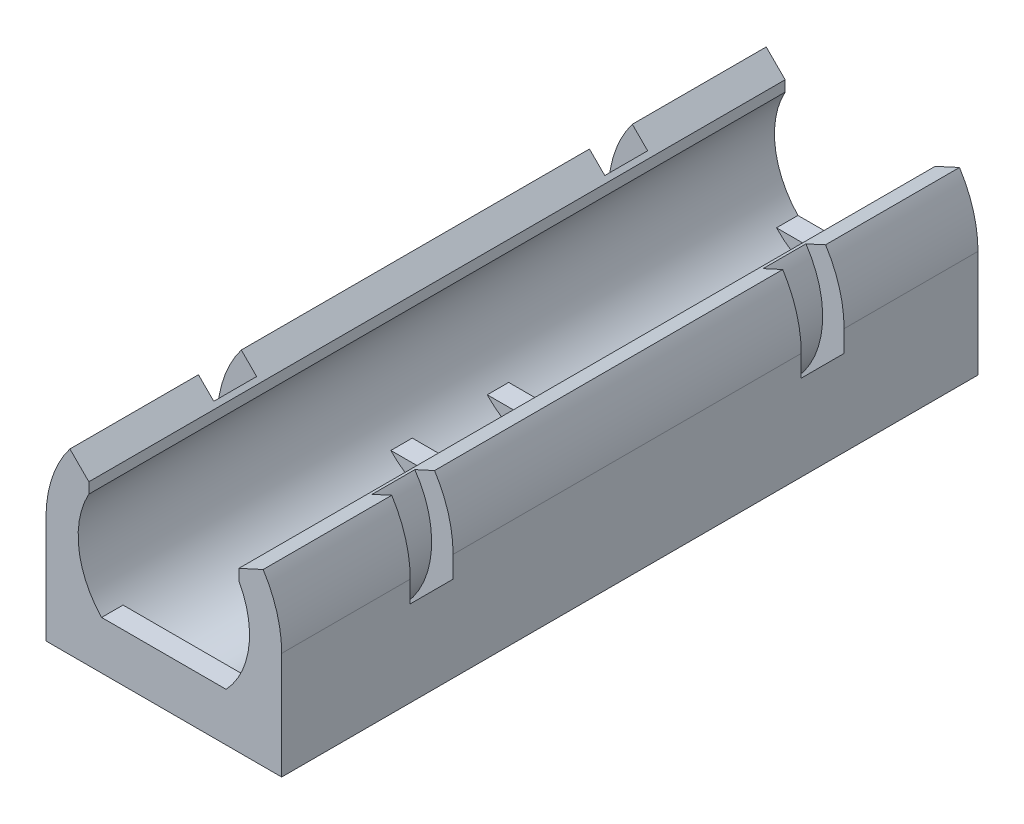
ISO-10303-21;
HEADER;
FILE_DESCRIPTION(('STEP AP214'),'2;1');
FILE_NAME('part.step','',(''),(''),'','','');
FILE_SCHEMA(('AUTOMOTIVE_DESIGN { 1 0 10303 214 1 1 1 1 }'));
ENDSEC;
DATA;
#1=APPLICATION_CONTEXT('core data for automotive mechanical design processes');
#2=APPLICATION_PROTOCOL_DEFINITION('international standard','automotive_design',2000,#1);
#3=PRODUCT_CONTEXT('',#1,'mechanical');
#4=PRODUCT('Part','Part','',(#3));
#5=PRODUCT_RELATED_PRODUCT_CATEGORY('part','',(#4));
#6=PRODUCT_DEFINITION_FORMATION('','',#4);
#7=PRODUCT_DEFINITION_CONTEXT('part definition',#1,'design');
#8=PRODUCT_DEFINITION('design','',#6,#7);
#9=PRODUCT_DEFINITION_SHAPE('','',#8);
#10=(LENGTH_UNIT() NAMED_UNIT(*) SI_UNIT(.MILLI.,.METRE.));
#11=(NAMED_UNIT(*) PLANE_ANGLE_UNIT() SI_UNIT($,.RADIAN.));
#12=(NAMED_UNIT(*) SI_UNIT($,.STERADIAN.) SOLID_ANGLE_UNIT());
#13=UNCERTAINTY_MEASURE_WITH_UNIT(LENGTH_MEASURE(1.E-05),#10,'distance_accuracy_value','');
#14=(GEOMETRIC_REPRESENTATION_CONTEXT(3) GLOBAL_UNCERTAINTY_ASSIGNED_CONTEXT((#13)) GLOBAL_UNIT_ASSIGNED_CONTEXT((#10,
#11,#12)) REPRESENTATION_CONTEXT('',''));
#15=CARTESIAN_POINT('',(0.,0.,0.));
#16=DIRECTION('',(0.,0.,1.));
#17=DIRECTION('',(1.,0.,0.));
#18=AXIS2_PLACEMENT_3D('',#15,#16,#17);
#19=CARTESIAN_POINT('',(0.,0.,32.5));
#20=DIRECTION('',(0.,1.,0.));
#21=DIRECTION('',(-1.,0.,0.));
#22=AXIS2_PLACEMENT_3D('',#19,#20,#21);
#23=PLANE('',#22);
#24=DIRECTION('',(0.,0.,1.));
#25=VECTOR('',#24,1.);
#26=CARTESIAN_POINT('',(3.45016556472926,0.,16.5));
#27=LINE('',#26,#25);
#28=CARTESIAN_POINT('',(3.45016556472926,0.,20.5));
#29=VERTEX_POINT('',#28);
#30=CARTESIAN_POINT('',(3.45016556472926,0.,16.5));
#31=VERTEX_POINT('',#30);
#32=EDGE_CURVE('E559',#29,#31,#27,.F.);
#33=ORIENTED_EDGE('',*,*,#32,.F.);
#34=DIRECTION('',(-1.,0.,0.));
#35=VECTOR('',#34,1.);
#36=CARTESIAN_POINT('',(0.,0.,20.5));
#37=LINE('',#36,#35);
#38=CARTESIAN_POINT('',(18.5498344352707,0.,20.5));
#39=VERTEX_POINT('',#38);
#40=EDGE_CURVE('E576',#39,#29,#37,.T.);
#41=ORIENTED_EDGE('',*,*,#40,.F.);
#42=DIRECTION('',(0.,0.,1.));
#43=VECTOR('',#42,1.);
#44=CARTESIAN_POINT('',(18.5498344352707,0.,16.5));
#45=LINE('',#44,#43);
#46=CARTESIAN_POINT('',(18.5498344352707,0.,16.5));
#47=VERTEX_POINT('',#46);
#48=EDGE_CURVE('E562',#47,#39,#45,.T.);
#49=ORIENTED_EDGE('',*,*,#48,.F.);
#50=DIRECTION('',(-1.,0.,0.));
#51=VECTOR('',#50,1.);
#52=CARTESIAN_POINT('',(0.,0.,16.5));
#53=LINE('',#52,#51);
#54=EDGE_CURVE('E569',#47,#31,#53,.T.);
#55=ORIENTED_EDGE('',*,*,#54,.T.);
#56=EDGE_LOOP('',(#33,#41,#49,#55));
#57=FACE_BOUND('',#56,.T.);
#58=DIRECTION('',(0.,0.,-1.));
#59=VECTOR('',#58,1.);
#60=CARTESIAN_POINT('',(22.,0.,32.5));
#61=LINE('',#60,#59);
#62=CARTESIAN_POINT('',(22.,0.,32.5));
#63=VERTEX_POINT('',#62);
#64=CARTESIAN_POINT('',(22.,0.,-32.5));
#65=VERTEX_POINT('',#64);
#66=EDGE_CURVE('E327',#63,#65,#61,.T.);
#67=ORIENTED_EDGE('',*,*,#66,.F.);
#68=DIRECTION('',(1.,0.,0.));
#69=VECTOR('',#68,1.);
#70=CARTESIAN_POINT('',(0.,0.,32.5));
#71=LINE('',#70,#69);
#72=CARTESIAN_POINT('',(0.,0.,32.5));
#73=VERTEX_POINT('',#72);
#74=EDGE_CURVE('E473',#73,#63,#71,.T.);
#75=ORIENTED_EDGE('',*,*,#74,.F.);
#76=DIRECTION('',(0.,0.,-1.));
#77=VECTOR('',#76,1.);
#78=CARTESIAN_POINT('',(0.,0.,32.5));
#79=LINE('',#78,#77);
#80=CARTESIAN_POINT('',(0.,0.,-32.5));
#81=VERTEX_POINT('',#80);
#82=EDGE_CURVE('E334',#73,#81,#79,.T.);
#83=ORIENTED_EDGE('',*,*,#82,.T.);
#84=DIRECTION('',(1.,0.,0.));
#85=VECTOR('',#84,1.);
#86=CARTESIAN_POINT('',(0.,0.,-32.5));
#87=LINE('',#86,#85);
#88=EDGE_CURVE('E441',#81,#65,#87,.T.);
#89=ORIENTED_EDGE('',*,*,#88,.T.);
#90=EDGE_LOOP('',(#67,#75,#83,#89));
#91=FACE_BOUND('',#90,.T.);
#92=DIRECTION('',(0.,0.,1.));
#93=VECTOR('',#92,1.);
#94=CARTESIAN_POINT('',(3.45016556472926,0.,-20.));
#95=LINE('',#94,#93);
#96=CARTESIAN_POINT('',(3.45016556472926,0.,-16.));
#97=VERTEX_POINT('',#96);
#98=CARTESIAN_POINT('',(3.45016556472926,0.,-20.));
#99=VERTEX_POINT('',#98);
#100=EDGE_CURVE('E627',#97,#99,#95,.F.);
#101=ORIENTED_EDGE('',*,*,#100,.F.);
#102=DIRECTION('',(-1.,0.,0.));
#103=VECTOR('',#102,1.);
#104=CARTESIAN_POINT('',(0.,0.,-16.));
#105=LINE('',#104,#103);
#106=CARTESIAN_POINT('',(18.5498344352707,0.,-16.));
#107=VERTEX_POINT('',#106);
#108=EDGE_CURVE('E644',#107,#97,#105,.T.);
#109=ORIENTED_EDGE('',*,*,#108,.F.);
#110=DIRECTION('',(0.,0.,1.));
#111=VECTOR('',#110,1.);
#112=CARTESIAN_POINT('',(18.5498344352707,0.,-20.));
#113=LINE('',#112,#111);
#114=CARTESIAN_POINT('',(18.5498344352707,0.,-20.));
#115=VERTEX_POINT('',#114);
#116=EDGE_CURVE('E633',#115,#107,#113,.T.);
#117=ORIENTED_EDGE('',*,*,#116,.F.);
#118=DIRECTION('',(-1.,0.,0.));
#119=VECTOR('',#118,1.);
#120=CARTESIAN_POINT('',(0.,0.,-20.));
#121=LINE('',#120,#119);
#122=EDGE_CURVE('E636',#115,#99,#121,.T.);
#123=ORIENTED_EDGE('',*,*,#122,.T.);
#124=EDGE_LOOP('',(#101,#109,#117,#123));
#125=FACE_BOUND('',#124,.T.);
#126=ADVANCED_FACE('F39',(#57,#91,#125),#23,.F.);
#127=CARTESIAN_POINT('',(11.,10.,32.5));
#128=DIRECTION('',(0.,0.,-1.));
#129=DIRECTION('',(-1.,0.,0.));
#130=AXIS2_PLACEMENT_3D('',#127,#128,#129);
#131=CYLINDRICAL_SURFACE('',#130,11.);
#132=CARTESIAN_POINT('',(11.,10.,-16.));
#133=DIRECTION('',(0.,0.,-1.));
#134=DIRECTION('',(-1.,0.,0.));
#135=AXIS2_PLACEMENT_3D('',#132,#133,#134);
#136=CIRCLE('',#135,11.);
#137=CARTESIAN_POINT('',(0.,10.,-16.));
#138=VERTEX_POINT('',#137);
#139=CARTESIAN_POINT('',(2.23136675272622,16.6416165934812,-16.));
#140=VERTEX_POINT('',#139);
#141=EDGE_CURVE('E412',#138,#140,#136,.T.);
#142=ORIENTED_EDGE('',*,*,#141,.F.);
#143=DIRECTION('',(0.,0.,-1.));
#144=VECTOR('',#143,1.);
#145=CARTESIAN_POINT('',(0.,10.,32.5));
#146=LINE('',#145,#144);
#147=CARTESIAN_POINT('',(0.,10.,16.5));
#148=VERTEX_POINT('',#147);
#149=EDGE_CURVE('E348',#148,#138,#146,.T.);
#150=ORIENTED_EDGE('',*,*,#149,.F.);
#151=CARTESIAN_POINT('',(11.,10.,16.5));
#152=DIRECTION('',(0.,0.,-1.));
#153=DIRECTION('',(-1.,0.,0.));
#154=AXIS2_PLACEMENT_3D('',#151,#152,#153);
#155=CIRCLE('',#154,11.);
#156=CARTESIAN_POINT('',(2.23136675272622,16.6416165934812,16.5));
#157=VERTEX_POINT('',#156);
#158=EDGE_CURVE('E619',#148,#157,#155,.T.);
#159=ORIENTED_EDGE('',*,*,#158,.T.);
#160=DIRECTION('',(0.,0.,-1.));
#161=VECTOR('',#160,1.);
#162=CARTESIAN_POINT('',(2.23136675272622,16.6416165934812,32.5));
#163=LINE('',#162,#161);
#164=EDGE_CURVE('E354',#157,#140,#163,.T.);
#165=ORIENTED_EDGE('',*,*,#164,.T.);
#166=EDGE_LOOP('',(#142,#150,#159,#165));
#167=FACE_BOUND('',#166,.T.);
#168=ADVANCED_FACE('F695',(#167),#131,.T.);
#169=CARTESIAN_POINT('',(11.,10.,32.5));
#170=DIRECTION('',(0.,0.,-1.));
#171=DIRECTION('',(-1.,0.,0.));
#172=AXIS2_PLACEMENT_3D('',#169,#170,#171);
#173=CYLINDRICAL_SURFACE('',#172,11.);
#174=CARTESIAN_POINT('',(20.2726264490755,15.9176345557921,-16.));
#175=VERTEX_POINT('',#174);
#176=CARTESIAN_POINT('',(22.,10.,-16.));
#177=VERTEX_POINT('',#176);
#178=EDGE_CURVE('E400',#175,#177,#136,.T.);
#179=ORIENTED_EDGE('',*,*,#178,.F.);
#180=DIRECTION('',(0.,0.,-1.));
#181=VECTOR('',#180,1.);
#182=CARTESIAN_POINT('',(20.2726264490755,15.9176345557921,32.5));
#183=LINE('',#182,#181);
#184=CARTESIAN_POINT('',(20.2726264490755,15.9176345557921,16.5));
#185=VERTEX_POINT('',#184);
#186=EDGE_CURVE('E322',#185,#175,#183,.T.);
#187=ORIENTED_EDGE('',*,*,#186,.F.);
#188=CARTESIAN_POINT('',(22.,10.,16.5));
#189=VERTEX_POINT('',#188);
#190=EDGE_CURVE('E595',#185,#189,#155,.T.);
#191=ORIENTED_EDGE('',*,*,#190,.T.);
#192=DIRECTION('',(0.,0.,-1.));
#193=VECTOR('',#192,1.);
#194=CARTESIAN_POINT('',(22.,10.,32.5));
#195=LINE('',#194,#193);
#196=EDGE_CURVE('E312',#189,#177,#195,.T.);
#197=ORIENTED_EDGE('',*,*,#196,.T.);
#198=EDGE_LOOP('',(#179,#187,#191,#197));
#199=FACE_BOUND('',#198,.T.);
#200=ADVANCED_FACE('F408',(#199),#173,.T.);
#201=CARTESIAN_POINT('',(11.,10.,20.5));
#202=DIRECTION('',(0.,0.,-1.));
#203=DIRECTION('',(-1.,0.,0.));
#204=AXIS2_PLACEMENT_3D('',#201,#202,#203);
#205=CIRCLE('',#204,11.);
#206=CARTESIAN_POINT('',(0.,10.,20.5));
#207=VERTEX_POINT('',#206);
#208=CARTESIAN_POINT('',(2.23136675272622,16.6416165934812,20.5));
#209=VERTEX_POINT('',#208);
#210=EDGE_CURVE('E604',#207,#209,#205,.T.);
#211=ORIENTED_EDGE('',*,*,#210,.F.);
#212=CARTESIAN_POINT('',(0.,10.,32.5));
#213=VERTEX_POINT('',#212);
#214=EDGE_CURVE('E343',#213,#207,#146,.T.);
#215=ORIENTED_EDGE('',*,*,#214,.F.);
#216=CARTESIAN_POINT('',(11.,10.,32.5));
#217=DIRECTION('',(0.,0.,1.));
#218=DIRECTION('',(1.,0.,0.));
#219=AXIS2_PLACEMENT_3D('',#216,#217,#218);
#220=CIRCLE('',#219,11.);
#221=CARTESIAN_POINT('',(2.23136675272622,16.6416165934812,32.5));
#222=VERTEX_POINT('',#221);
#223=EDGE_CURVE('E478',#222,#213,#220,.T.);
#224=ORIENTED_EDGE('',*,*,#223,.F.);
#225=EDGE_CURVE('E349',#222,#209,#163,.T.);
#226=ORIENTED_EDGE('',*,*,#225,.T.);
#227=EDGE_LOOP('',(#211,#215,#224,#226));
#228=FACE_BOUND('',#227,.T.);
#229=ADVANCED_FACE('F771',(#228),#131,.T.);
#230=CARTESIAN_POINT('',(20.2726264490755,15.9176345557921,20.5));
#231=VERTEX_POINT('',#230);
#232=CARTESIAN_POINT('',(22.,10.,20.5));
#233=VERTEX_POINT('',#232);
#234=EDGE_CURVE('E607',#231,#233,#205,.T.);
#235=ORIENTED_EDGE('',*,*,#234,.F.);
#236=CARTESIAN_POINT('',(20.2726264490755,15.9176345557921,32.5));
#237=VERTEX_POINT('',#236);
#238=EDGE_CURVE('E313',#237,#231,#183,.T.);
#239=ORIENTED_EDGE('',*,*,#238,.F.);
#240=CARTESIAN_POINT('',(11.,10.,32.5));
#241=DIRECTION('',(0.,0.,1.));
#242=DIRECTION('',(1.,0.,0.));
#243=AXIS2_PLACEMENT_3D('',#240,#241,#242);
#244=CIRCLE('',#243,11.);
#245=CARTESIAN_POINT('',(22.,10.,32.5));
#246=VERTEX_POINT('',#245);
#247=EDGE_CURVE('E468',#246,#237,#244,.T.);
#248=ORIENTED_EDGE('',*,*,#247,.F.);
#249=EDGE_CURVE('E315',#246,#233,#195,.T.);
#250=ORIENTED_EDGE('',*,*,#249,.T.);
#251=EDGE_LOOP('',(#235,#239,#248,#250));
#252=FACE_BOUND('',#251,.T.);
#253=ADVANCED_FACE('F719',(#252),#173,.T.);
#254=CARTESIAN_POINT('',(11.,10.,32.5));
#255=DIRECTION('',(0.,0.,-1.));
#256=DIRECTION('',(-1.,0.,0.));
#257=AXIS2_PLACEMENT_3D('',#254,#255,#256);
#258=CYLINDRICAL_SURFACE('',#257,8.);
#259=CARTESIAN_POINT('',(11.,10.,3.5));
#260=DIRECTION('',(0.,0.,1.));
#261=DIRECTION('',(1.,0.,0.));
#262=AXIS2_PLACEMENT_3D('',#259,#260,#261);
#263=CIRCLE('',#262,8.);
#264=CARTESIAN_POINT('',(16.8094750193111,4.5,3.5));
#265=VERTEX_POINT('',#264);
#266=CARTESIAN_POINT('',(5.19052498068889,4.5,3.5));
#267=VERTEX_POINT('',#266);
#268=EDGE_CURVE('E525',#265,#267,#263,.F.);
#269=ORIENTED_EDGE('',*,*,#268,.F.);
#270=DIRECTION('',(0.,0.,-1.));
#271=VECTOR('',#270,1.);
#272=CARTESIAN_POINT('',(16.8094750193111,4.5,32.5));
#273=LINE('',#272,#271);
#274=CARTESIAN_POINT('',(16.8094750193111,4.5,5.5));
#275=VERTEX_POINT('',#274);
#276=EDGE_CURVE('E374',#265,#275,#273,.F.);
#277=ORIENTED_EDGE('',*,*,#276,.T.);
#278=CARTESIAN_POINT('',(11.,10.,5.5));
#279=DIRECTION('',(0.,0.,1.));
#280=DIRECTION('',(1.,0.,0.));
#281=AXIS2_PLACEMENT_3D('',#278,#279,#280);
#282=CIRCLE('',#281,8.);
#283=CARTESIAN_POINT('',(5.19052498068889,4.5,5.5));
#284=VERTEX_POINT('',#283);
#285=EDGE_CURVE('E529',#275,#284,#282,.F.);
#286=ORIENTED_EDGE('',*,*,#285,.T.);
#287=DIRECTION('',(0.,0.,-1.));
#288=VECTOR('',#287,1.);
#289=CARTESIAN_POINT('',(5.19052498068889,4.5,32.5));
#290=LINE('',#289,#288);
#291=EDGE_CURVE('E370',#284,#267,#290,.T.);
#292=ORIENTED_EDGE('',*,*,#291,.T.);
#293=EDGE_LOOP('',(#269,#277,#286,#292));
#294=FACE_BOUND('',#293,.T.);
#295=CARTESIAN_POINT('',(11.,10.,-5.49999999999999));
#296=DIRECTION('',(0.,0.,1.));
#297=DIRECTION('',(1.,0.,0.));
#298=AXIS2_PLACEMENT_3D('',#295,#296,#297);
#299=CIRCLE('',#298,8.);
#300=CARTESIAN_POINT('',(16.8094750193111,4.5,-5.49999999999999));
#301=VERTEX_POINT('',#300);
#302=CARTESIAN_POINT('',(5.19052498068889,4.5,-5.49999999999999));
#303=VERTEX_POINT('',#302);
#304=EDGE_CURVE('E510',#301,#303,#299,.F.);
#305=ORIENTED_EDGE('',*,*,#304,.F.);
#306=DIRECTION('',(0.,0.,-1.));
#307=VECTOR('',#306,1.);
#308=CARTESIAN_POINT('',(16.8094750193111,4.5,32.5));
#309=LINE('',#308,#307);
#310=CARTESIAN_POINT('',(16.8094750193111,4.5,-3.49999999999999));
#311=VERTEX_POINT('',#310);
#312=EDGE_CURVE('E366',#301,#311,#309,.F.);
#313=ORIENTED_EDGE('',*,*,#312,.T.);
#314=CARTESIAN_POINT('',(11.,10.,-3.49999999999999));
#315=DIRECTION('',(0.,0.,1.));
#316=DIRECTION('',(1.,0.,0.));
#317=AXIS2_PLACEMENT_3D('',#314,#315,#316);
#318=CIRCLE('',#317,8.);
#319=CARTESIAN_POINT('',(5.19052498068889,4.5,-3.49999999999999));
#320=VERTEX_POINT('',#319);
#321=EDGE_CURVE('E514',#311,#320,#318,.F.);
#322=ORIENTED_EDGE('',*,*,#321,.T.);
#323=DIRECTION('',(0.,0.,-1.));
#324=VECTOR('',#323,1.);
#325=CARTESIAN_POINT('',(5.19052498068889,4.5,32.5));
#326=LINE('',#325,#324);
#327=EDGE_CURVE('E362',#320,#303,#326,.T.);
#328=ORIENTED_EDGE('',*,*,#327,.T.);
#329=EDGE_LOOP('',(#305,#313,#322,#328));
#330=FACE_BOUND('',#329,.T.);
#331=CARTESIAN_POINT('',(11.,10.,30.5));
#332=DIRECTION('',(0.,0.,-1.));
#333=DIRECTION('',(-1.,0.,0.));
#334=AXIS2_PLACEMENT_3D('',#331,#332,#333);
#335=CIRCLE('',#334,8.);
#336=CARTESIAN_POINT('',(5.19052498068889,4.5,30.5));
#337=VERTEX_POINT('',#336);
#338=CARTESIAN_POINT('',(16.8094750193111,4.5,30.5));
#339=VERTEX_POINT('',#338);
#340=EDGE_CURVE('E540',#337,#339,#335,.F.);
#341=ORIENTED_EDGE('',*,*,#340,.T.);
#342=DIRECTION('',(0.,0.,-1.));
#343=VECTOR('',#342,1.);
#344=CARTESIAN_POINT('',(16.8094750193111,4.5,32.5));
#345=LINE('',#344,#343);
#346=CARTESIAN_POINT('',(16.8094750193111,4.5,32.5));
#347=VERTEX_POINT('',#346);
#348=EDGE_CURVE('E544',#339,#347,#345,.F.);
#349=ORIENTED_EDGE('',*,*,#348,.T.);
#350=CARTESIAN_POINT('',(11.,10.,32.5));
#351=DIRECTION('',(0.,0.,-1.));
#352=DIRECTION('',(1.,0.,0.));
#353=AXIS2_PLACEMENT_3D('',#350,#351,#352);
#354=CIRCLE('',#353,8.);
#355=CARTESIAN_POINT('',(18.,13.8729833462074,32.5));
#356=VERTEX_POINT('',#355);
#357=EDGE_CURVE('E487',#356,#347,#354,.T.);
#358=ORIENTED_EDGE('',*,*,#357,.F.);
#359=DIRECTION('',(0.,0.,-1.));
#360=VECTOR('',#359,1.);
#361=CARTESIAN_POINT('',(18.,13.8729833462074,32.5));
#362=LINE('',#361,#360);
#363=CARTESIAN_POINT('',(18.,13.8729833462074,-32.5));
#364=VERTEX_POINT('',#363);
#365=EDGE_CURVE('E424',#356,#364,#362,.T.);
#366=ORIENTED_EDGE('',*,*,#365,.T.);
#367=CARTESIAN_POINT('',(11.,10.,-32.5));
#368=DIRECTION('',(0.,0.,-1.));
#369=DIRECTION('',(1.,0.,0.));
#370=AXIS2_PLACEMENT_3D('',#367,#368,#369);
#371=CIRCLE('',#370,8.);
#372=CARTESIAN_POINT('',(16.8094750193111,4.5,-32.5));
#373=VERTEX_POINT('',#372);
#374=EDGE_CURVE('E458',#364,#373,#371,.T.);
#375=ORIENTED_EDGE('',*,*,#374,.T.);
#376=DIRECTION('',(0.,0.,-1.));
#377=VECTOR('',#376,1.);
#378=CARTESIAN_POINT('',(16.8094750193111,4.5,32.5));
#379=LINE('',#378,#377);
#380=CARTESIAN_POINT('',(16.8094750193111,4.5,-30.5));
#381=VERTEX_POINT('',#380);
#382=EDGE_CURVE('E495',#373,#381,#379,.F.);
#383=ORIENTED_EDGE('',*,*,#382,.T.);
#384=CARTESIAN_POINT('',(11.,10.,-30.5));
#385=DIRECTION('',(0.,0.,1.));
#386=DIRECTION('',(1.,0.,0.));
#387=AXIS2_PLACEMENT_3D('',#384,#385,#386);
#388=CIRCLE('',#387,8.);
#389=CARTESIAN_POINT('',(5.19052498068889,4.5,-30.5));
#390=VERTEX_POINT('',#389);
#391=EDGE_CURVE('E491',#381,#390,#388,.F.);
#392=ORIENTED_EDGE('',*,*,#391,.T.);
#393=DIRECTION('',(0.,0.,-1.));
#394=VECTOR('',#393,1.);
#395=CARTESIAN_POINT('',(5.19052498068889,4.5,32.5));
#396=LINE('',#395,#394);
#397=CARTESIAN_POINT('',(5.19052498068889,4.5,-32.5));
#398=VERTEX_POINT('',#397);
#399=EDGE_CURVE('E499',#390,#398,#396,.T.);
#400=ORIENTED_EDGE('',*,*,#399,.T.);
#401=CARTESIAN_POINT('',(4.,13.8729833462074,-32.5));
#402=VERTEX_POINT('',#401);
#403=EDGE_CURVE('E462',#398,#402,#371,.T.);
#404=ORIENTED_EDGE('',*,*,#403,.T.);
#405=DIRECTION('',(0.,0.,-1.));
#406=VECTOR('',#405,1.);
#407=CARTESIAN_POINT('',(4.,13.8729833462074,32.5));
#408=LINE('',#407,#406);
#409=CARTESIAN_POINT('',(4.,13.8729833462074,32.5));
#410=VERTEX_POINT('',#409);
#411=EDGE_CURVE('E358',#410,#402,#408,.T.);
#412=ORIENTED_EDGE('',*,*,#411,.F.);
#413=CARTESIAN_POINT('',(5.19052498068889,4.5,32.5));
#414=VERTEX_POINT('',#413);
#415=EDGE_CURVE('E432',#414,#410,#354,.T.);
#416=ORIENTED_EDGE('',*,*,#415,.F.);
#417=DIRECTION('',(0.,0.,-1.));
#418=VECTOR('',#417,1.);
#419=CARTESIAN_POINT('',(5.19052498068889,4.5,32.5));
#420=LINE('',#419,#418);
#421=EDGE_CURVE('E548',#414,#337,#420,.T.);
#422=ORIENTED_EDGE('',*,*,#421,.T.);
#423=EDGE_LOOP('',(#341,#349,#358,#366,#375,#383,#392,#400,#404,#412,#416,#422));
#424=FACE_BOUND('',#423,.T.);
#425=ADVANCED_FACE('F41',(#294,#330,#424),#258,.F.);
#426=CARTESIAN_POINT('',(4.,13.8729833462074,32.5));
#427=DIRECTION('',(-1.,0.,0.));
#428=DIRECTION('',(0.,0.,1.));
#429=AXIS2_PLACEMENT_3D('',#426,#427,#428);
#430=PLANE('',#429);
#431=DIRECTION('',(0.,1.,0.));
#432=VECTOR('',#431,1.);
#433=CARTESIAN_POINT('',(4.,13.8729833462074,-32.5));
#434=LINE('',#433,#432);
#435=CARTESIAN_POINT('',(4.,14.8729833462074,-32.5));
#436=VERTEX_POINT('',#435);
#437=EDGE_CURVE('E455',#402,#436,#434,.T.);
#438=ORIENTED_EDGE('',*,*,#437,.T.);
#439=DIRECTION('',(0.,0.,-1.));
#440=VECTOR('',#439,1.);
#441=CARTESIAN_POINT('',(4.,14.8729833462074,32.5));
#442=LINE('',#441,#440);
#443=CARTESIAN_POINT('',(4.,14.8729833462074,32.5));
#444=VERTEX_POINT('',#443);
#445=EDGE_CURVE('E353',#444,#436,#442,.T.);
#446=ORIENTED_EDGE('',*,*,#445,.F.);
#447=DIRECTION('',(0.,1.,0.));
#448=VECTOR('',#447,1.);
#449=CARTESIAN_POINT('',(4.,13.8729833462074,32.5));
#450=LINE('',#449,#448);
#451=EDGE_CURVE('E484',#410,#444,#450,.T.);
#452=ORIENTED_EDGE('',*,*,#451,.F.);
#453=ORIENTED_EDGE('',*,*,#411,.T.);
#454=EDGE_LOOP('',(#438,#446,#452,#453));
#455=FACE_BOUND('',#454,.T.);
#456=ADVANCED_FACE('F752',(#455),#430,.F.);
#457=CARTESIAN_POINT('',(4.,14.8729833462074,32.5));
#458=DIRECTION('',(-0.707106781186546,-0.707106781186548,0.));
#459=DIRECTION('',(0.707106781186549,-0.707106781186546,0.));
#460=AXIS2_PLACEMENT_3D('',#457,#458,#459);
#461=PLANE('',#460);
#462=CARTESIAN_POINT('',(2.23136675272622,16.6416165934812,-20.));
#463=VERTEX_POINT('',#462);
#464=CARTESIAN_POINT('',(2.23136675272622,16.6416165934812,-32.5));
#465=VERTEX_POINT('',#464);
#466=EDGE_CURVE('E347',#463,#465,#163,.T.);
#467=ORIENTED_EDGE('',*,*,#466,.F.);
#468=DIRECTION('',(0.707106781186549,-0.707106781186546,0.));
#469=VECTOR('',#468,1.);
#470=CARTESIAN_POINT('',(4.,14.8729833462074,-20.));
#471=LINE('',#470,#469);
#472=CARTESIAN_POINT('',(3.66202356507875,15.2109597811287,-20.));
#473=VERTEX_POINT('',#472);
#474=EDGE_CURVE('E640',#463,#473,#471,.T.);
#475=ORIENTED_EDGE('',*,*,#474,.T.);
#476=DIRECTION('',(0.,0.,1.));
#477=VECTOR('',#476,1.);
#478=CARTESIAN_POINT('',(3.66202356507875,15.2109597811287,-20.));
#479=LINE('',#478,#477);
#480=CARTESIAN_POINT('',(3.66202356507875,15.2109597811287,-16.));
#481=VERTEX_POINT('',#480);
#482=EDGE_CURVE('E650',#473,#481,#479,.T.);
#483=ORIENTED_EDGE('',*,*,#482,.T.);
#484=DIRECTION('',(0.707106781186549,-0.707106781186546,0.));
#485=VECTOR('',#484,1.);
#486=CARTESIAN_POINT('',(4.,14.8729833462074,-16.));
#487=LINE('',#486,#485);
#488=EDGE_CURVE('E647',#140,#481,#487,.T.);
#489=ORIENTED_EDGE('',*,*,#488,.F.);
#490=ORIENTED_EDGE('',*,*,#164,.F.);
#491=DIRECTION('',(0.707106781186549,-0.707106781186546,0.));
#492=VECTOR('',#491,1.);
#493=CARTESIAN_POINT('',(4.,14.8729833462074,16.5));
#494=LINE('',#493,#492);
#495=CARTESIAN_POINT('',(3.66202356507876,15.2109597811287,16.5));
#496=VERTEX_POINT('',#495);
#497=EDGE_CURVE('E565',#157,#496,#494,.T.);
#498=ORIENTED_EDGE('',*,*,#497,.T.);
#499=DIRECTION('',(0.,0.,1.));
#500=VECTOR('',#499,1.);
#501=CARTESIAN_POINT('',(3.66202356507876,15.2109597811287,16.5));
#502=LINE('',#501,#500);
#503=CARTESIAN_POINT('',(3.66202356507876,15.2109597811287,20.5));
#504=VERTEX_POINT('',#503);
#505=EDGE_CURVE('E579',#496,#504,#502,.T.);
#506=ORIENTED_EDGE('',*,*,#505,.T.);
#507=DIRECTION('',(0.707106781186549,-0.707106781186546,0.));
#508=VECTOR('',#507,1.);
#509=CARTESIAN_POINT('',(4.,14.8729833462074,20.5));
#510=LINE('',#509,#508);
#511=EDGE_CURVE('E573',#209,#504,#510,.T.);
#512=ORIENTED_EDGE('',*,*,#511,.F.);
#513=ORIENTED_EDGE('',*,*,#225,.F.);
#514=DIRECTION('',(-0.707106781186549,0.707106781186546,0.));
#515=VECTOR('',#514,1.);
#516=CARTESIAN_POINT('',(4.,14.8729833462074,32.5));
#517=LINE('',#516,#515);
#518=EDGE_CURVE('E481',#444,#222,#517,.T.);
#519=ORIENTED_EDGE('',*,*,#518,.F.);
#520=ORIENTED_EDGE('',*,*,#445,.T.);
#521=DIRECTION('',(-0.707106781186549,0.707106781186546,0.));
#522=VECTOR('',#521,1.);
#523=CARTESIAN_POINT('',(4.,14.8729833462074,-32.5));
#524=LINE('',#523,#522);
#525=EDGE_CURVE('E451',#436,#465,#524,.T.);
#526=ORIENTED_EDGE('',*,*,#525,.T.);
#527=EDGE_LOOP('',(#467,#475,#483,#489,#490,#498,#506,#512,#513,#519,#520,#526));
#528=FACE_BOUND('',#527,.T.);
#529=ADVANCED_FACE('F684',(#528),#461,.F.);
#530=CARTESIAN_POINT('',(0.,10.,-20.));
#531=VERTEX_POINT('',#530);
#532=CARTESIAN_POINT('',(0.,10.,-32.5));
#533=VERTEX_POINT('',#532);
#534=EDGE_CURVE('E340',#531,#533,#146,.T.);
#535=ORIENTED_EDGE('',*,*,#534,.F.);
#536=CARTESIAN_POINT('',(11.,10.,-20.));
#537=DIRECTION('',(0.,0.,-1.));
#538=DIRECTION('',(-1.,0.,0.));
#539=AXIS2_PLACEMENT_3D('',#536,#537,#538);
#540=CIRCLE('',#539,11.);
#541=EDGE_CURVE('E294',#531,#463,#540,.T.);
#542=ORIENTED_EDGE('',*,*,#541,.T.);
#543=ORIENTED_EDGE('',*,*,#466,.T.);
#544=CARTESIAN_POINT('',(11.,10.,-32.5));
#545=DIRECTION('',(0.,0.,1.));
#546=DIRECTION('',(1.,0.,0.));
#547=AXIS2_PLACEMENT_3D('',#544,#545,#546);
#548=CIRCLE('',#547,11.);
#549=EDGE_CURVE('E447',#465,#533,#548,.T.);
#550=ORIENTED_EDGE('',*,*,#549,.T.);
#551=EDGE_LOOP('',(#535,#542,#543,#550));
#552=FACE_BOUND('',#551,.T.);
#553=ADVANCED_FACE('F792',(#552),#131,.T.);
#554=CARTESIAN_POINT('',(0.,0.,32.5));
#555=DIRECTION('',(1.,0.,0.));
#556=DIRECTION('',(0.,1.,0.));
#557=AXIS2_PLACEMENT_3D('',#554,#555,#556);
#558=PLANE('',#557);
#559=DIRECTION('',(0.,0.,1.));
#560=VECTOR('',#559,1.);
#561=CARTESIAN_POINT('',(0.,8.00000000000001,-20.));
#562=LINE('',#561,#560);
#563=CARTESIAN_POINT('',(0.,8.00000000000002,-20.));
#564=VERTEX_POINT('',#563);
#565=CARTESIAN_POINT('',(0.,8.00000000000001,-16.));
#566=VERTEX_POINT('',#565);
#567=EDGE_CURVE('E657',#564,#566,#562,.T.);
#568=ORIENTED_EDGE('',*,*,#567,.F.);
#569=DIRECTION('',(0.,1.,0.));
#570=VECTOR('',#569,1.);
#571=CARTESIAN_POINT('',(0.,10.,-20.));
#572=LINE('',#571,#570);
#573=EDGE_CURVE('E63',#564,#531,#572,.T.);
#574=ORIENTED_EDGE('',*,*,#573,.T.);
#575=ORIENTED_EDGE('',*,*,#534,.T.);
#576=DIRECTION('',(0.,-1.,0.));
#577=VECTOR('',#576,1.);
#578=CARTESIAN_POINT('',(0.,0.,-32.5));
#579=LINE('',#578,#577);
#580=EDGE_CURVE('E444',#533,#81,#579,.T.);
#581=ORIENTED_EDGE('',*,*,#580,.T.);
#582=ORIENTED_EDGE('',*,*,#82,.F.);
#583=DIRECTION('',(0.,-1.,0.));
#584=VECTOR('',#583,1.);
#585=CARTESIAN_POINT('',(0.,0.,32.5));
#586=LINE('',#585,#584);
#587=EDGE_CURVE('E476',#213,#73,#586,.T.);
#588=ORIENTED_EDGE('',*,*,#587,.F.);
#589=ORIENTED_EDGE('',*,*,#214,.T.);
#590=DIRECTION('',(0.,1.,0.));
#591=VECTOR('',#590,1.);
#592=CARTESIAN_POINT('',(0.,10.,20.5));
#593=LINE('',#592,#591);
#594=CARTESIAN_POINT('',(0.,8.00000000000001,20.5));
#595=VERTEX_POINT('',#594);
#596=EDGE_CURVE('E592',#595,#207,#593,.T.);
#597=ORIENTED_EDGE('',*,*,#596,.F.);
#598=DIRECTION('',(0.,0.,1.));
#599=VECTOR('',#598,1.);
#600=CARTESIAN_POINT('',(0.,8.00000000000001,16.5));
#601=LINE('',#600,#599);
#602=CARTESIAN_POINT('',(0.,8.00000000000002,16.5));
#603=VERTEX_POINT('',#602);
#604=EDGE_CURVE('E587',#603,#595,#601,.T.);
#605=ORIENTED_EDGE('',*,*,#604,.F.);
#606=DIRECTION('',(0.,1.,0.));
#607=VECTOR('',#606,1.);
#608=CARTESIAN_POINT('',(0.,10.,16.5));
#609=LINE('',#608,#607);
#610=EDGE_CURVE('E591',#603,#148,#609,.T.);
#611=ORIENTED_EDGE('',*,*,#610,.T.);
#612=ORIENTED_EDGE('',*,*,#149,.T.);
#613=DIRECTION('',(0.,1.,0.));
#614=VECTOR('',#613,1.);
#615=CARTESIAN_POINT('',(0.,10.,-16.));
#616=LINE('',#615,#614);
#617=EDGE_CURVE('E304',#566,#138,#616,.T.);
#618=ORIENTED_EDGE('',*,*,#617,.F.);
#619=EDGE_LOOP('',(#568,#574,#575,#581,#582,#588,#589,#597,#605,#611,#612,#618));
#620=FACE_BOUND('',#619,.T.);
#621=ADVANCED_FACE('F732',(#620),#558,.F.);
#622=CARTESIAN_POINT('',(22.,0.,32.5));
#623=DIRECTION('',(-1.,0.,0.));
#624=DIRECTION('',(0.,0.,1.));
#625=AXIS2_PLACEMENT_3D('',#622,#623,#624);
#626=PLANE('',#625);
#627=CARTESIAN_POINT('',(22.,10.,-20.));
#628=VERTEX_POINT('',#627);
#629=CARTESIAN_POINT('',(22.,10.,-32.5));
#630=VERTEX_POINT('',#629);
#631=EDGE_CURVE('E300',#628,#630,#195,.T.);
#632=ORIENTED_EDGE('',*,*,#631,.F.);
#633=DIRECTION('',(0.,-1.,0.));
#634=VECTOR('',#633,1.);
#635=CARTESIAN_POINT('',(22.,10.,-20.));
#636=LINE('',#635,#634);
#637=CARTESIAN_POINT('',(22.,8.00000000000001,-20.));
#638=VERTEX_POINT('',#637);
#639=EDGE_CURVE('E284',#628,#638,#636,.T.);
#640=ORIENTED_EDGE('',*,*,#639,.T.);
#641=DIRECTION('',(0.,0.,1.));
#642=VECTOR('',#641,1.);
#643=CARTESIAN_POINT('',(22.,8.00000000000001,-20.));
#644=LINE('',#643,#642);
#645=CARTESIAN_POINT('',(22.,8.00000000000001,-16.));
#646=VERTEX_POINT('',#645);
#647=EDGE_CURVE('E654',#638,#646,#644,.T.);
#648=ORIENTED_EDGE('',*,*,#647,.T.);
#649=DIRECTION('',(0.,-1.,0.));
#650=VECTOR('',#649,1.);
#651=CARTESIAN_POINT('',(22.,10.,-16.));
#652=LINE('',#651,#650);
#653=EDGE_CURVE('E668',#177,#646,#652,.T.);
#654=ORIENTED_EDGE('',*,*,#653,.F.);
#655=ORIENTED_EDGE('',*,*,#196,.F.);
#656=DIRECTION('',(0.,-1.,0.));
#657=VECTOR('',#656,1.);
#658=CARTESIAN_POINT('',(22.,10.,16.5));
#659=LINE('',#658,#657);
#660=CARTESIAN_POINT('',(22.,8.00000000000001,16.5));
#661=VERTEX_POINT('',#660);
#662=EDGE_CURVE('E615',#189,#661,#659,.T.);
#663=ORIENTED_EDGE('',*,*,#662,.T.);
#664=DIRECTION('',(0.,0.,1.));
#665=VECTOR('',#664,1.);
#666=CARTESIAN_POINT('',(22.,8.00000000000001,16.5));
#667=LINE('',#666,#665);
#668=CARTESIAN_POINT('',(22.,8.00000000000001,20.5));
#669=VERTEX_POINT('',#668);
#670=EDGE_CURVE('E583',#661,#669,#667,.T.);
#671=ORIENTED_EDGE('',*,*,#670,.T.);
#672=DIRECTION('',(0.,-1.,0.));
#673=VECTOR('',#672,1.);
#674=CARTESIAN_POINT('',(22.,10.,20.5));
#675=LINE('',#674,#673);
#676=EDGE_CURVE('E601',#233,#669,#675,.T.);
#677=ORIENTED_EDGE('',*,*,#676,.F.);
#678=ORIENTED_EDGE('',*,*,#249,.F.);
#679=DIRECTION('',(0.,1.,0.));
#680=VECTOR('',#679,1.);
#681=CARTESIAN_POINT('',(22.,0.,32.5));
#682=LINE('',#681,#680);
#683=EDGE_CURVE('E471',#63,#246,#682,.T.);
#684=ORIENTED_EDGE('',*,*,#683,.F.);
#685=ORIENTED_EDGE('',*,*,#66,.T.);
#686=DIRECTION('',(0.,1.,0.));
#687=VECTOR('',#686,1.);
#688=CARTESIAN_POINT('',(22.,0.,-32.5));
#689=LINE('',#688,#687);
#690=EDGE_CURVE('E309',#65,#630,#689,.T.);
#691=ORIENTED_EDGE('',*,*,#690,.T.);
#692=EDGE_LOOP('',(#632,#640,#648,#654,#655,#663,#671,#677,#678,#684,#685,#691));
#693=FACE_BOUND('',#692,.T.);
#694=ADVANCED_FACE('F306',(#693),#626,.F.);
#695=CARTESIAN_POINT('',(20.2726264490755,15.9176345557921,-20.));
#696=VERTEX_POINT('',#695);
#697=CARTESIAN_POINT('',(20.2726264490755,15.9176345557921,-32.5));
#698=VERTEX_POINT('',#697);
#699=EDGE_CURVE('E302',#696,#698,#183,.T.);
#700=ORIENTED_EDGE('',*,*,#699,.F.);
#701=EDGE_CURVE('E288',#696,#628,#540,.T.);
#702=ORIENTED_EDGE('',*,*,#701,.T.);
#703=ORIENTED_EDGE('',*,*,#631,.T.);
#704=CARTESIAN_POINT('',(11.,10.,-32.5));
#705=DIRECTION('',(0.,0.,1.));
#706=DIRECTION('',(1.,0.,0.));
#707=AXIS2_PLACEMENT_3D('',#704,#705,#706);
#708=CIRCLE('',#707,11.);
#709=EDGE_CURVE('E436',#630,#698,#708,.T.);
#710=ORIENTED_EDGE('',*,*,#709,.T.);
#711=EDGE_LOOP('',(#700,#702,#703,#710));
#712=FACE_BOUND('',#711,.T.);
#713=ADVANCED_FACE('F298',(#712),#173,.T.);
#714=CARTESIAN_POINT('',(18.,14.8729833462074,32.5));
#715=DIRECTION('',(0.417655811576932,-0.908605317536726,0.));
#716=DIRECTION('',(0.908605317536726,0.417655811576932,0.));
#717=AXIS2_PLACEMENT_3D('',#714,#715,#716);
#718=PLANE('',#717);
#719=DIRECTION('',(0.,0.,1.));
#720=VECTOR('',#719,1.);
#721=CARTESIAN_POINT('',(18.4342868632319,15.0726106528273,-20.));
#722=LINE('',#721,#720);
#723=CARTESIAN_POINT('',(18.434286863232,15.0726106528273,-16.));
#724=VERTEX_POINT('',#723);
#725=CARTESIAN_POINT('',(18.4342868632319,15.0726106528273,-20.));
#726=VERTEX_POINT('',#725);
#727=EDGE_CURVE('E389',#724,#726,#722,.F.);
#728=ORIENTED_EDGE('',*,*,#727,.T.);
#729=DIRECTION('',(0.908605317536726,0.417655811576932,0.));
#730=VECTOR('',#729,1.);
#731=CARTESIAN_POINT('',(18.,14.8729833462074,-20.));
#732=LINE('',#731,#730);
#733=EDGE_CURVE('E11',#726,#696,#732,.T.);
#734=ORIENTED_EDGE('',*,*,#733,.T.);
#735=ORIENTED_EDGE('',*,*,#699,.T.);
#736=DIRECTION('',(-0.908605317536726,-0.417655811576932,0.));
#737=VECTOR('',#736,1.);
#738=CARTESIAN_POINT('',(18.,14.8729833462074,-32.5));
#739=LINE('',#738,#737);
#740=CARTESIAN_POINT('',(18.,14.8729833462074,-32.5));
#741=VERTEX_POINT('',#740);
#742=EDGE_CURVE('E433',#698,#741,#739,.T.);
#743=ORIENTED_EDGE('',*,*,#742,.T.);
#744=DIRECTION('',(0.,0.,-1.));
#745=VECTOR('',#744,1.);
#746=CARTESIAN_POINT('',(18.,14.8729833462074,32.5));
#747=LINE('',#746,#745);
#748=CARTESIAN_POINT('',(18.,14.8729833462074,32.5));
#749=VERTEX_POINT('',#748);
#750=EDGE_CURVE('E419',#749,#741,#747,.T.);
#751=ORIENTED_EDGE('',*,*,#750,.F.);
#752=DIRECTION('',(-0.908605317536726,-0.417655811576932,0.));
#753=VECTOR('',#752,1.);
#754=CARTESIAN_POINT('',(18.,14.8729833462074,32.5));
#755=LINE('',#754,#753);
#756=EDGE_CURVE('E465',#237,#749,#755,.T.);
#757=ORIENTED_EDGE('',*,*,#756,.F.);
#758=ORIENTED_EDGE('',*,*,#238,.T.);
#759=DIRECTION('',(0.908605317536726,0.417655811576932,0.));
#760=VECTOR('',#759,1.);
#761=CARTESIAN_POINT('',(18.,14.8729833462074,20.5));
#762=LINE('',#761,#760);
#763=CARTESIAN_POINT('',(18.434286863232,15.0726106528273,20.5));
#764=VERTEX_POINT('',#763);
#765=EDGE_CURVE('E382',#764,#231,#762,.T.);
#766=ORIENTED_EDGE('',*,*,#765,.F.);
#767=DIRECTION('',(0.,0.,1.));
#768=VECTOR('',#767,1.);
#769=CARTESIAN_POINT('',(18.434286863232,15.0726106528273,16.5));
#770=LINE('',#769,#768);
#771=CARTESIAN_POINT('',(18.434286863232,15.0726106528273,16.5));
#772=VERTEX_POINT('',#771);
#773=EDGE_CURVE('E378',#764,#772,#770,.F.);
#774=ORIENTED_EDGE('',*,*,#773,.T.);
#775=DIRECTION('',(0.908605317536726,0.417655811576932,0.));
#776=VECTOR('',#775,1.);
#777=CARTESIAN_POINT('',(18.,14.8729833462074,16.5));
#778=LINE('',#777,#776);
#779=EDGE_CURVE('E385',#772,#185,#778,.T.);
#780=ORIENTED_EDGE('',*,*,#779,.T.);
#781=ORIENTED_EDGE('',*,*,#186,.T.);
#782=DIRECTION('',(0.908605317536726,0.417655811576932,0.));
#783=VECTOR('',#782,1.);
#784=CARTESIAN_POINT('',(18.,14.8729833462074,-16.));
#785=LINE('',#784,#783);
#786=EDGE_CURVE('E48',#724,#175,#785,.T.);
#787=ORIENTED_EDGE('',*,*,#786,.F.);
#788=EDGE_LOOP('',(#728,#734,#735,#743,#751,#757,#758,#766,#774,#780,#781,#787));
#789=FACE_BOUND('',#788,.T.);
#790=ADVANCED_FACE('F415',(#789),#718,.F.);
#791=CARTESIAN_POINT('',(18.,13.8729833462074,32.5));
#792=DIRECTION('',(1.,0.,0.));
#793=DIRECTION('',(0.,0.,-1.));
#794=AXIS2_PLACEMENT_3D('',#791,#792,#793);
#795=PLANE('',#794);
#796=DIRECTION('',(0.,-1.,0.));
#797=VECTOR('',#796,1.);
#798=CARTESIAN_POINT('',(18.,13.8729833462074,-32.5));
#799=LINE('',#798,#797);
#800=EDGE_CURVE('E429',#741,#364,#799,.T.);
#801=ORIENTED_EDGE('',*,*,#800,.T.);
#802=ORIENTED_EDGE('',*,*,#365,.F.);
#803=DIRECTION('',(0.,-1.,0.));
#804=VECTOR('',#803,1.);
#805=CARTESIAN_POINT('',(18.,13.8729833462074,32.5));
#806=LINE('',#805,#804);
#807=EDGE_CURVE('E428',#749,#356,#806,.T.);
#808=ORIENTED_EDGE('',*,*,#807,.F.);
#809=ORIENTED_EDGE('',*,*,#750,.T.);
#810=EDGE_LOOP('',(#801,#802,#808,#809));
#811=FACE_BOUND('',#810,.T.);
#812=ADVANCED_FACE('F708',(#811),#795,.F.);
#813=CARTESIAN_POINT('',(11.,10.,32.5));
#814=DIRECTION('',(0.,0.,1.));
#815=DIRECTION('',(1.,0.,0.));
#816=AXIS2_PLACEMENT_3D('',#813,#814,#815);
#817=PLANE('',#816);
#818=ORIENTED_EDGE('',*,*,#74,.T.);
#819=ORIENTED_EDGE('',*,*,#683,.T.);
#820=ORIENTED_EDGE('',*,*,#247,.T.);
#821=ORIENTED_EDGE('',*,*,#756,.T.);
#822=ORIENTED_EDGE('',*,*,#807,.T.);
#823=ORIENTED_EDGE('',*,*,#357,.T.);
#824=DIRECTION('',(1.,0.,0.));
#825=VECTOR('',#824,1.);
#826=CARTESIAN_POINT('',(3.3,4.5,32.5));
#827=LINE('',#826,#825);
#828=EDGE_CURVE('E552',#414,#347,#827,.T.);
#829=ORIENTED_EDGE('',*,*,#828,.F.);
#830=ORIENTED_EDGE('',*,*,#415,.T.);
#831=ORIENTED_EDGE('',*,*,#451,.T.);
#832=ORIENTED_EDGE('',*,*,#518,.T.);
#833=ORIENTED_EDGE('',*,*,#223,.T.);
#834=ORIENTED_EDGE('',*,*,#587,.T.);
#835=EDGE_LOOP('',(#818,#819,#820,#821,#822,#823,#829,#830,#831,#832,#833,#834));
#836=FACE_BOUND('',#835,.T.);
#837=ADVANCED_FACE('F714',(#836),#817,.T.);
#838=CARTESIAN_POINT('',(11.,10.,-32.5));
#839=DIRECTION('',(0.,0.,1.));
#840=DIRECTION('',(1.,0.,0.));
#841=AXIS2_PLACEMENT_3D('',#838,#839,#840);
#842=PLANE('',#841);
#843=ORIENTED_EDGE('',*,*,#690,.F.);
#844=ORIENTED_EDGE('',*,*,#88,.F.);
#845=ORIENTED_EDGE('',*,*,#580,.F.);
#846=ORIENTED_EDGE('',*,*,#549,.F.);
#847=ORIENTED_EDGE('',*,*,#525,.F.);
#848=ORIENTED_EDGE('',*,*,#437,.F.);
#849=ORIENTED_EDGE('',*,*,#403,.F.);
#850=DIRECTION('',(-1.,0.,0.));
#851=VECTOR('',#850,1.);
#852=CARTESIAN_POINT('',(18.7,4.5,-32.5));
#853=LINE('',#852,#851);
#854=EDGE_CURVE('E507',#373,#398,#853,.T.);
#855=ORIENTED_EDGE('',*,*,#854,.F.);
#856=ORIENTED_EDGE('',*,*,#374,.F.);
#857=ORIENTED_EDGE('',*,*,#800,.F.);
#858=ORIENTED_EDGE('',*,*,#742,.F.);
#859=ORIENTED_EDGE('',*,*,#709,.F.);
#860=EDGE_LOOP('',(#843,#844,#845,#846,#847,#848,#849,#855,#856,#857,#858,#859));
#861=FACE_BOUND('',#860,.T.);
#862=ADVANCED_FACE('F703',(#861),#842,.F.);
#863=CARTESIAN_POINT('',(18.7,4.5,-30.5));
#864=DIRECTION('',(0.,0.,1.));
#865=DIRECTION('',(1.,0.,0.));
#866=AXIS2_PLACEMENT_3D('',#863,#864,#865);
#867=PLANE('',#866);
#868=ORIENTED_EDGE('',*,*,#391,.F.);
#869=DIRECTION('',(-1.,0.,0.));
#870=VECTOR('',#869,1.);
#871=CARTESIAN_POINT('',(18.7,4.5,-30.5));
#872=LINE('',#871,#870);
#873=EDGE_CURVE('E503',#381,#390,#872,.T.);
#874=ORIENTED_EDGE('',*,*,#873,.T.);
#875=EDGE_LOOP('',(#868,#874));
#876=FACE_BOUND('',#875,.T.);
#877=ADVANCED_FACE('F837',(#876),#867,.T.);
#878=CARTESIAN_POINT('',(0.,4.5,0.));
#879=DIRECTION('',(0.,1.,0.));
#880=DIRECTION('',(0.,0.,1.));
#881=AXIS2_PLACEMENT_3D('',#878,#879,#880);
#882=PLANE('',#881);
#883=ORIENTED_EDGE('',*,*,#382,.F.);
#884=ORIENTED_EDGE('',*,*,#854,.T.);
#885=ORIENTED_EDGE('',*,*,#399,.F.);
#886=ORIENTED_EDGE('',*,*,#873,.F.);
#887=EDGE_LOOP('',(#883,#884,#885,#886));
#888=FACE_BOUND('',#887,.T.);
#889=ADVANCED_FACE('F834',(#888),#882,.T.);
#890=CARTESIAN_POINT('',(0.,4.5,0.));
#891=DIRECTION('',(0.,1.,0.));
#892=DIRECTION('',(0.,0.,1.));
#893=AXIS2_PLACEMENT_3D('',#890,#891,#892);
#894=PLANE('',#893);
#895=ORIENTED_EDGE('',*,*,#312,.F.);
#896=DIRECTION('',(-1.,0.,0.));
#897=VECTOR('',#896,1.);
#898=CARTESIAN_POINT('',(18.7,4.5,-5.49999999999999));
#899=LINE('',#898,#897);
#900=EDGE_CURVE('E518',#301,#303,#899,.T.);
#901=ORIENTED_EDGE('',*,*,#900,.T.);
#902=ORIENTED_EDGE('',*,*,#327,.F.);
#903=DIRECTION('',(-1.,0.,0.));
#904=VECTOR('',#903,1.);
#905=CARTESIAN_POINT('',(18.7,4.5,-3.49999999999999));
#906=LINE('',#905,#904);
#907=EDGE_CURVE('E521',#311,#320,#906,.T.);
#908=ORIENTED_EDGE('',*,*,#907,.F.);
#909=EDGE_LOOP('',(#895,#901,#902,#908));
#910=FACE_BOUND('',#909,.T.);
#911=ADVANCED_FACE('F816',(#910),#894,.T.);
#912=CARTESIAN_POINT('',(18.7,4.5,-5.49999999999999));
#913=DIRECTION('',(0.,0.,1.));
#914=DIRECTION('',(1.,0.,0.));
#915=AXIS2_PLACEMENT_3D('',#912,#913,#914);
#916=PLANE('',#915);
#917=ORIENTED_EDGE('',*,*,#900,.F.);
#918=ORIENTED_EDGE('',*,*,#304,.T.);
#919=EDGE_LOOP('',(#917,#918));
#920=FACE_BOUND('',#919,.T.);
#921=ADVANCED_FACE('F814',(#920),#916,.F.);
#922=CARTESIAN_POINT('',(18.7,4.5,-3.49999999999999));
#923=DIRECTION('',(0.,0.,1.));
#924=DIRECTION('',(1.,0.,0.));
#925=AXIS2_PLACEMENT_3D('',#922,#923,#924);
#926=PLANE('',#925);
#927=ORIENTED_EDGE('',*,*,#321,.F.);
#928=ORIENTED_EDGE('',*,*,#907,.T.);
#929=EDGE_LOOP('',(#927,#928));
#930=FACE_BOUND('',#929,.T.);
#931=ADVANCED_FACE('F819',(#930),#926,.T.);
#932=CARTESIAN_POINT('',(0.,4.5,0.));
#933=DIRECTION('',(0.,1.,0.));
#934=DIRECTION('',(0.,0.,1.));
#935=AXIS2_PLACEMENT_3D('',#932,#933,#934);
#936=PLANE('',#935);
#937=ORIENTED_EDGE('',*,*,#276,.F.);
#938=DIRECTION('',(-1.,0.,0.));
#939=VECTOR('',#938,1.);
#940=CARTESIAN_POINT('',(18.7,4.5,3.5));
#941=LINE('',#940,#939);
#942=EDGE_CURVE('E533',#265,#267,#941,.T.);
#943=ORIENTED_EDGE('',*,*,#942,.T.);
#944=ORIENTED_EDGE('',*,*,#291,.F.);
#945=DIRECTION('',(-1.,0.,0.));
#946=VECTOR('',#945,1.);
#947=CARTESIAN_POINT('',(18.7,4.5,5.5));
#948=LINE('',#947,#946);
#949=EDGE_CURVE('E536',#275,#284,#948,.T.);
#950=ORIENTED_EDGE('',*,*,#949,.F.);
#951=EDGE_LOOP('',(#937,#943,#944,#950));
#952=FACE_BOUND('',#951,.T.);
#953=ADVANCED_FACE('F821',(#952),#936,.T.);
#954=CARTESIAN_POINT('',(18.7,4.5,3.5));
#955=DIRECTION('',(0.,0.,1.));
#956=DIRECTION('',(1.,0.,0.));
#957=AXIS2_PLACEMENT_3D('',#954,#955,#956);
#958=PLANE('',#957);
#959=ORIENTED_EDGE('',*,*,#942,.F.);
#960=ORIENTED_EDGE('',*,*,#268,.T.);
#961=EDGE_LOOP('',(#959,#960));
#962=FACE_BOUND('',#961,.T.);
#963=ADVANCED_FACE('F827',(#962),#958,.F.);
#964=CARTESIAN_POINT('',(18.7,4.5,5.5));
#965=DIRECTION('',(0.,0.,1.));
#966=DIRECTION('',(1.,0.,0.));
#967=AXIS2_PLACEMENT_3D('',#964,#965,#966);
#968=PLANE('',#967);
#969=ORIENTED_EDGE('',*,*,#285,.F.);
#970=ORIENTED_EDGE('',*,*,#949,.T.);
#971=EDGE_LOOP('',(#969,#970));
#972=FACE_BOUND('',#971,.T.);
#973=ADVANCED_FACE('F954',(#972),#968,.T.);
#974=CARTESIAN_POINT('',(3.3,4.5,30.5));
#975=DIRECTION('',(0.,0.,-1.));
#976=DIRECTION('',(-1.,0.,0.));
#977=AXIS2_PLACEMENT_3D('',#974,#975,#976);
#978=PLANE('',#977);
#979=ORIENTED_EDGE('',*,*,#340,.F.);
#980=DIRECTION('',(1.,0.,0.));
#981=VECTOR('',#980,1.);
#982=CARTESIAN_POINT('',(3.3,4.5,30.5));
#983=LINE('',#982,#981);
#984=EDGE_CURVE('E555',#337,#339,#983,.T.);
#985=ORIENTED_EDGE('',*,*,#984,.T.);
#986=EDGE_LOOP('',(#979,#985));
#987=FACE_BOUND('',#986,.T.);
#988=ADVANCED_FACE('F964',(#987),#978,.T.);
#989=CARTESIAN_POINT('',(0.,4.5,0.));
#990=DIRECTION('',(0.,1.,0.));
#991=DIRECTION('',(0.,0.,1.));
#992=AXIS2_PLACEMENT_3D('',#989,#990,#991);
#993=PLANE('',#992);
#994=ORIENTED_EDGE('',*,*,#348,.F.);
#995=ORIENTED_EDGE('',*,*,#984,.F.);
#996=ORIENTED_EDGE('',*,*,#421,.F.);
#997=ORIENTED_EDGE('',*,*,#828,.T.);
#998=EDGE_LOOP('',(#994,#995,#996,#997));
#999=FACE_BOUND('',#998,.T.);
#1000=ADVANCED_FACE('F975',(#999),#993,.T.);
#1001=CARTESIAN_POINT('',(11.,8.00000000000001,16.5));
#1002=DIRECTION('',(0.,0.,1.));
#1003=DIRECTION('',(1.,0.,0.));
#1004=AXIS2_PLACEMENT_3D('',#1001,#1002,#1003);
#1005=CYLINDRICAL_SURFACE('',#1004,11.);
#1006=ORIENTED_EDGE('',*,*,#32,.T.);
#1007=CARTESIAN_POINT('',(11.,8.00000000000001,16.5));
#1008=DIRECTION('',(0.,0.,-1.));
#1009=DIRECTION('',(-1.,0.,0.));
#1010=AXIS2_PLACEMENT_3D('',#1007,#1008,#1009);
#1011=CIRCLE('',#1010,11.);
#1012=EDGE_CURVE('E614',#31,#603,#1011,.T.);
#1013=ORIENTED_EDGE('',*,*,#1012,.T.);
#1014=ORIENTED_EDGE('',*,*,#604,.T.);
#1015=CARTESIAN_POINT('',(11.,8.00000000000001,20.5));
#1016=DIRECTION('',(0.,0.,-1.));
#1017=DIRECTION('',(-1.,0.,0.));
#1018=AXIS2_PLACEMENT_3D('',#1015,#1016,#1017);
#1019=CIRCLE('',#1018,11.);
#1020=EDGE_CURVE('E600',#29,#595,#1019,.T.);
#1021=ORIENTED_EDGE('',*,*,#1020,.F.);
#1022=EDGE_LOOP('',(#1006,#1013,#1014,#1021));
#1023=FACE_BOUND('',#1022,.T.);
#1024=ADVANCED_FACE('F761',(#1023),#1005,.F.);
#1025=ORIENTED_EDGE('',*,*,#48,.T.);
#1026=EDGE_CURVE('E596',#669,#39,#1019,.T.);
#1027=ORIENTED_EDGE('',*,*,#1026,.F.);
#1028=ORIENTED_EDGE('',*,*,#670,.F.);
#1029=EDGE_CURVE('E611',#661,#47,#1011,.T.);
#1030=ORIENTED_EDGE('',*,*,#1029,.T.);
#1031=EDGE_LOOP('',(#1025,#1027,#1028,#1030));
#1032=FACE_BOUND('',#1031,.T.);
#1033=ADVANCED_FACE('F992',(#1032),#1005,.F.);
#1034=CARTESIAN_POINT('',(11.,10.,16.5));
#1035=DIRECTION('',(0.,0.,-1.));
#1036=DIRECTION('',(-1.,0.,0.));
#1037=AXIS2_PLACEMENT_3D('',#1034,#1035,#1036);
#1038=PLANE('',#1037);
#1039=ORIENTED_EDGE('',*,*,#158,.F.);
#1040=ORIENTED_EDGE('',*,*,#610,.F.);
#1041=ORIENTED_EDGE('',*,*,#1012,.F.);
#1042=ORIENTED_EDGE('',*,*,#54,.F.);
#1043=ORIENTED_EDGE('',*,*,#1029,.F.);
#1044=ORIENTED_EDGE('',*,*,#662,.F.);
#1045=ORIENTED_EDGE('',*,*,#190,.F.);
#1046=ORIENTED_EDGE('',*,*,#779,.F.);
#1047=CARTESIAN_POINT('',(11.,10.,16.5));
#1048=DIRECTION('',(0.,0.,-1.));
#1049=DIRECTION('',(-1.,0.,0.));
#1050=AXIS2_PLACEMENT_3D('',#1047,#1048,#1049);
#1051=CIRCLE('',#1050,9.);
#1052=EDGE_CURVE('E626',#772,#496,#1051,.T.);
#1053=ORIENTED_EDGE('',*,*,#1052,.T.);
#1054=ORIENTED_EDGE('',*,*,#497,.F.);
#1055=EDGE_LOOP('',(#1039,#1040,#1041,#1042,#1043,#1044,#1045,#1046,#1053,#1054));
#1056=FACE_BOUND('',#1055,.T.);
#1057=ADVANCED_FACE('F742',(#1056),#1038,.F.);
#1058=CARTESIAN_POINT('',(11.,10.,20.5));
#1059=DIRECTION('',(0.,0.,-1.));
#1060=DIRECTION('',(-1.,0.,0.));
#1061=AXIS2_PLACEMENT_3D('',#1058,#1059,#1060);
#1062=PLANE('',#1061);
#1063=ORIENTED_EDGE('',*,*,#511,.T.);
#1064=CARTESIAN_POINT('',(11.,10.,20.5));
#1065=DIRECTION('',(0.,0.,-1.));
#1066=DIRECTION('',(-1.,0.,0.));
#1067=AXIS2_PLACEMENT_3D('',#1064,#1065,#1066);
#1068=CIRCLE('',#1067,9.);
#1069=EDGE_CURVE('E623',#764,#504,#1068,.T.);
#1070=ORIENTED_EDGE('',*,*,#1069,.F.);
#1071=ORIENTED_EDGE('',*,*,#765,.T.);
#1072=ORIENTED_EDGE('',*,*,#234,.T.);
#1073=ORIENTED_EDGE('',*,*,#676,.T.);
#1074=ORIENTED_EDGE('',*,*,#1026,.T.);
#1075=ORIENTED_EDGE('',*,*,#40,.T.);
#1076=ORIENTED_EDGE('',*,*,#1020,.T.);
#1077=ORIENTED_EDGE('',*,*,#596,.T.);
#1078=ORIENTED_EDGE('',*,*,#210,.T.);
#1079=EDGE_LOOP('',(#1063,#1070,#1071,#1072,#1073,#1074,#1075,#1076,#1077,#1078));
#1080=FACE_BOUND('',#1079,.T.);
#1081=ADVANCED_FACE('F768',(#1080),#1062,.T.);
#1082=CARTESIAN_POINT('',(11.,10.,16.5));
#1083=DIRECTION('',(0.,0.,1.));
#1084=DIRECTION('',(1.,0.,0.));
#1085=AXIS2_PLACEMENT_3D('',#1082,#1083,#1084);
#1086=CYLINDRICAL_SURFACE('',#1085,9.);
#1087=ORIENTED_EDGE('',*,*,#1052,.F.);
#1088=ORIENTED_EDGE('',*,*,#773,.F.);
#1089=ORIENTED_EDGE('',*,*,#1069,.T.);
#1090=ORIENTED_EDGE('',*,*,#505,.F.);
#1091=EDGE_LOOP('',(#1087,#1088,#1089,#1090));
#1092=FACE_BOUND('',#1091,.T.);
#1093=ADVANCED_FACE('F775',(#1092),#1086,.T.);
#1094=CARTESIAN_POINT('',(11.,8.00000000000001,-20.));
#1095=DIRECTION('',(0.,0.,1.));
#1096=DIRECTION('',(1.,0.,0.));
#1097=AXIS2_PLACEMENT_3D('',#1094,#1095,#1096);
#1098=CYLINDRICAL_SURFACE('',#1097,11.);
#1099=ORIENTED_EDGE('',*,*,#100,.T.);
#1100=CARTESIAN_POINT('',(11.,8.00000000000001,-20.));
#1101=DIRECTION('',(0.,0.,-1.));
#1102=DIRECTION('',(-1.,0.,0.));
#1103=AXIS2_PLACEMENT_3D('',#1100,#1101,#1102);
#1104=CIRCLE('',#1103,11.);
#1105=EDGE_CURVE('E293',#99,#564,#1104,.T.);
#1106=ORIENTED_EDGE('',*,*,#1105,.T.);
#1107=ORIENTED_EDGE('',*,*,#567,.T.);
#1108=CARTESIAN_POINT('',(11.,8.00000000000001,-16.));
#1109=DIRECTION('',(0.,0.,-1.));
#1110=DIRECTION('',(-1.,0.,0.));
#1111=AXIS2_PLACEMENT_3D('',#1108,#1109,#1110);
#1112=CIRCLE('',#1111,11.);
#1113=EDGE_CURVE('E667',#97,#566,#1112,.T.);
#1114=ORIENTED_EDGE('',*,*,#1113,.F.);
#1115=EDGE_LOOP('',(#1099,#1106,#1107,#1114));
#1116=FACE_BOUND('',#1115,.T.);
#1117=ADVANCED_FACE('F727',(#1116),#1098,.F.);
#1118=ORIENTED_EDGE('',*,*,#116,.T.);
#1119=EDGE_CURVE('E663',#646,#107,#1112,.T.);
#1120=ORIENTED_EDGE('',*,*,#1119,.F.);
#1121=ORIENTED_EDGE('',*,*,#647,.F.);
#1122=EDGE_CURVE('E55',#638,#115,#1104,.T.);
#1123=ORIENTED_EDGE('',*,*,#1122,.T.);
#1124=EDGE_LOOP('',(#1118,#1120,#1121,#1123));
#1125=FACE_BOUND('',#1124,.T.);
#1126=ADVANCED_FACE('F739',(#1125),#1098,.F.);
#1127=CARTESIAN_POINT('',(11.,10.,-20.));
#1128=DIRECTION('',(0.,0.,-1.));
#1129=DIRECTION('',(-1.,0.,0.));
#1130=AXIS2_PLACEMENT_3D('',#1127,#1128,#1129);
#1131=PLANE('',#1130);
#1132=ORIENTED_EDGE('',*,*,#1122,.F.);
#1133=ORIENTED_EDGE('',*,*,#639,.F.);
#1134=ORIENTED_EDGE('',*,*,#701,.F.);
#1135=ORIENTED_EDGE('',*,*,#733,.F.);
#1136=CARTESIAN_POINT('',(11.,10.,-20.));
#1137=DIRECTION('',(0.,0.,-1.));
#1138=DIRECTION('',(-1.,0.,0.));
#1139=AXIS2_PLACEMENT_3D('',#1136,#1137,#1138);
#1140=CIRCLE('',#1139,9.);
#1141=EDGE_CURVE('E413',#726,#473,#1140,.T.);
#1142=ORIENTED_EDGE('',*,*,#1141,.T.);
#1143=ORIENTED_EDGE('',*,*,#474,.F.);
#1144=ORIENTED_EDGE('',*,*,#541,.F.);
#1145=ORIENTED_EDGE('',*,*,#573,.F.);
#1146=ORIENTED_EDGE('',*,*,#1105,.F.);
#1147=ORIENTED_EDGE('',*,*,#122,.F.);
#1148=EDGE_LOOP('',(#1132,#1133,#1134,#1135,#1142,#1143,#1144,#1145,#1146,#1147));
#1149=FACE_BOUND('',#1148,.T.);
#1150=ADVANCED_FACE('F286',(#1149),#1131,.F.);
#1151=CARTESIAN_POINT('',(11.,10.,-16.));
#1152=DIRECTION('',(0.,0.,-1.));
#1153=DIRECTION('',(-1.,0.,0.));
#1154=AXIS2_PLACEMENT_3D('',#1151,#1152,#1153);
#1155=PLANE('',#1154);
#1156=ORIENTED_EDGE('',*,*,#108,.T.);
#1157=ORIENTED_EDGE('',*,*,#1113,.T.);
#1158=ORIENTED_EDGE('',*,*,#617,.T.);
#1159=ORIENTED_EDGE('',*,*,#141,.T.);
#1160=ORIENTED_EDGE('',*,*,#488,.T.);
#1161=CARTESIAN_POINT('',(11.,10.,-16.));
#1162=DIRECTION('',(0.,0.,-1.));
#1163=DIRECTION('',(-1.,0.,0.));
#1164=AXIS2_PLACEMENT_3D('',#1161,#1162,#1163);
#1165=CIRCLE('',#1164,9.);
#1166=EDGE_CURVE('E403',#724,#481,#1165,.T.);
#1167=ORIENTED_EDGE('',*,*,#1166,.F.);
#1168=ORIENTED_EDGE('',*,*,#786,.T.);
#1169=ORIENTED_EDGE('',*,*,#178,.T.);
#1170=ORIENTED_EDGE('',*,*,#653,.T.);
#1171=ORIENTED_EDGE('',*,*,#1119,.T.);
#1172=EDGE_LOOP('',(#1156,#1157,#1158,#1159,#1160,#1167,#1168,#1169,#1170,#1171));
#1173=FACE_BOUND('',#1172,.T.);
#1174=ADVANCED_FACE('F399',(#1173),#1155,.T.);
#1175=CARTESIAN_POINT('',(11.,10.,-20.));
#1176=DIRECTION('',(0.,0.,1.));
#1177=DIRECTION('',(1.,0.,0.));
#1178=AXIS2_PLACEMENT_3D('',#1175,#1176,#1177);
#1179=CYLINDRICAL_SURFACE('',#1178,9.);
#1180=ORIENTED_EDGE('',*,*,#1141,.F.);
#1181=ORIENTED_EDGE('',*,*,#727,.F.);
#1182=ORIENTED_EDGE('',*,*,#1166,.T.);
#1183=ORIENTED_EDGE('',*,*,#482,.F.);
#1184=EDGE_LOOP('',(#1180,#1181,#1182,#1183));
#1185=FACE_BOUND('',#1184,.T.);
#1186=ADVANCED_FACE('F698',(#1185),#1179,.T.);
#1187=CLOSED_SHELL('',(#126,#168,#200,#229,#253,#425,#456,#529,#553,#621,#694,#713,#790,#812,
#837,#862,#877,#889,#911,#921,#931,#953,#963,#973,#988,#1000,#1024,#1033,#1057,#1081,#1093,
#1117,#1126,#1150,#1174,#1186));
#1188=MANIFOLD_SOLID_BREP('B2',#1187);
#1189=ADVANCED_BREP_SHAPE_REPRESENTATION('',(#18,#1188),#14);
#1190=SHAPE_DEFINITION_REPRESENTATION(#9,#1189);
ENDSEC;
END-ISO-10303-21;
